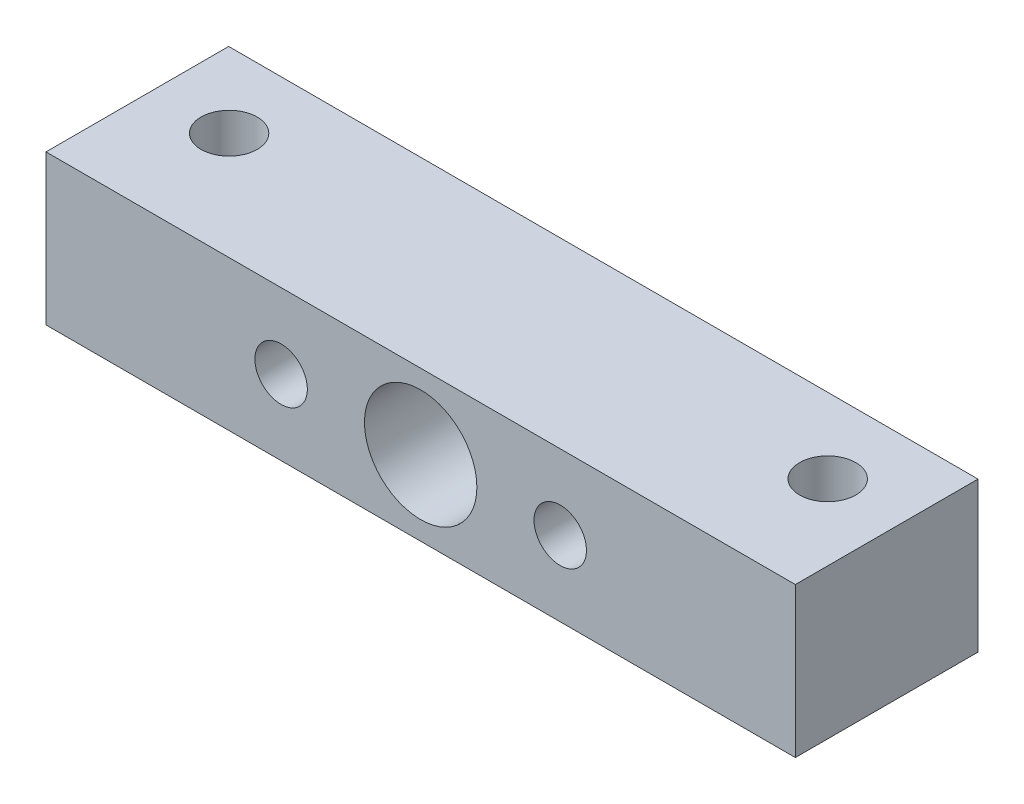
ISO-10303-21;
HEADER;
FILE_DESCRIPTION(('STEP AP214'),'2;1');
FILE_NAME('part.step','',(''),(''),'','','');
FILE_SCHEMA(('AUTOMOTIVE_DESIGN { 1 0 10303 214 1 1 1 1 }'));
ENDSEC;
DATA;
#1=APPLICATION_CONTEXT('core data for automotive mechanical design processes');
#2=APPLICATION_PROTOCOL_DEFINITION('international standard','automotive_design',2000,#1);
#3=PRODUCT_CONTEXT('',#1,'mechanical');
#4=PRODUCT('Part','Part','',(#3));
#5=PRODUCT_RELATED_PRODUCT_CATEGORY('part','',(#4));
#6=PRODUCT_DEFINITION_FORMATION('','',#4);
#7=PRODUCT_DEFINITION_CONTEXT('part definition',#1,'design');
#8=PRODUCT_DEFINITION('design','',#6,#7);
#9=PRODUCT_DEFINITION_SHAPE('','',#8);
#10=(LENGTH_UNIT() NAMED_UNIT(*) SI_UNIT(.MILLI.,.METRE.));
#11=(NAMED_UNIT(*) PLANE_ANGLE_UNIT() SI_UNIT($,.RADIAN.));
#12=(NAMED_UNIT(*) SI_UNIT($,.STERADIAN.) SOLID_ANGLE_UNIT());
#13=UNCERTAINTY_MEASURE_WITH_UNIT(LENGTH_MEASURE(1.E-05),#10,'distance_accuracy_value','');
#14=(GEOMETRIC_REPRESENTATION_CONTEXT(3) GLOBAL_UNCERTAINTY_ASSIGNED_CONTEXT((#13)) GLOBAL_UNIT_ASSIGNED_CONTEXT((#10,
#11,#12)) REPRESENTATION_CONTEXT('',''));
#15=CARTESIAN_POINT('',(0.,0.,0.));
#16=DIRECTION('',(0.,0.,1.));
#17=DIRECTION('',(1.,0.,0.));
#18=AXIS2_PLACEMENT_3D('',#15,#16,#17);
#19=CARTESIAN_POINT('',(0.,8.,0.));
#20=DIRECTION('',(0.,1.,0.));
#21=DIRECTION('',(0.,0.,1.));
#22=AXIS2_PLACEMENT_3D('',#19,#20,#21);
#23=PLANE('',#22);
#24=CARTESIAN_POINT('',(-15.9760563031056,8.,-0.874999999999995));
#25=DIRECTION('',(0.,1.,0.));
#26=DIRECTION('',(0.,0.,1.));
#27=AXIS2_PLACEMENT_3D('',#24,#25,#26);
#28=CIRCLE('',#27,1.5);
#29=CARTESIAN_POINT('',(-15.9760563031056,8.,0.625000000000005));
#30=VERTEX_POINT('',#29);
#31=EDGE_CURVE('E101',#30,#30,#28,.T.);
#32=ORIENTED_EDGE('',*,*,#31,.F.);
#33=EDGE_LOOP('',(#32));
#34=FACE_BOUND('',#33,.T.);
#35=DIRECTION('',(0.,0.,1.));
#36=VECTOR('',#35,1.);
#37=CARTESIAN_POINT('',(-20.,8.,4.875));
#38=LINE('',#37,#36);
#39=CARTESIAN_POINT('',(-20.,8.,-4.875));
#40=VERTEX_POINT('',#39);
#41=CARTESIAN_POINT('',(-20.,8.,4.875));
#42=VERTEX_POINT('',#41);
#43=EDGE_CURVE('E86',#40,#42,#38,.T.);
#44=ORIENTED_EDGE('',*,*,#43,.T.);
#45=DIRECTION('',(1.,0.,0.));
#46=VECTOR('',#45,1.);
#47=CARTESIAN_POINT('',(20.,8.,4.875));
#48=LINE('',#47,#46);
#49=CARTESIAN_POINT('',(20.,8.,4.875));
#50=VERTEX_POINT('',#49);
#51=EDGE_CURVE('E81',#42,#50,#48,.T.);
#52=ORIENTED_EDGE('',*,*,#51,.T.);
#53=DIRECTION('',(0.,0.,-1.));
#54=VECTOR('',#53,1.);
#55=CARTESIAN_POINT('',(20.,8.,4.875));
#56=LINE('',#55,#54);
#57=CARTESIAN_POINT('',(20.,8.,-4.875));
#58=VERTEX_POINT('',#57);
#59=EDGE_CURVE('E84',#50,#58,#56,.T.);
#60=ORIENTED_EDGE('',*,*,#59,.T.);
#61=DIRECTION('',(-1.,0.,0.));
#62=VECTOR('',#61,1.);
#63=CARTESIAN_POINT('',(20.,8.,-4.875));
#64=LINE('',#63,#62);
#65=EDGE_CURVE('E51',#58,#40,#64,.T.);
#66=ORIENTED_EDGE('',*,*,#65,.T.);
#67=EDGE_LOOP('',(#44,#52,#60,#66));
#68=FACE_BOUND('',#67,.T.);
#69=CARTESIAN_POINT('',(15.9760563031056,8.,-0.874999999999999));
#70=DIRECTION('',(0.,1.,0.));
#71=DIRECTION('',(0.,0.,-1.));
#72=AXIS2_PLACEMENT_3D('',#69,#70,#71);
#73=CIRCLE('',#72,1.5);
#74=CARTESIAN_POINT('',(15.9760563031056,8.,-2.375));
#75=VERTEX_POINT('',#74);
#76=EDGE_CURVE('E116',#75,#75,#73,.T.);
#77=ORIENTED_EDGE('',*,*,#76,.F.);
#78=EDGE_LOOP('',(#77));
#79=FACE_BOUND('',#78,.T.);
#80=ADVANCED_FACE('F34',(#34,#68,#79),#23,.T.);
#81=CARTESIAN_POINT('',(0.,0.,0.));
#82=DIRECTION('',(0.,1.,0.));
#83=DIRECTION('',(0.,0.,1.));
#84=AXIS2_PLACEMENT_3D('',#81,#82,#83);
#85=PLANE('',#84);
#86=DIRECTION('',(0.,0.,1.));
#87=VECTOR('',#86,1.);
#88=CARTESIAN_POINT('',(-20.,0.,4.875));
#89=LINE('',#88,#87);
#90=CARTESIAN_POINT('',(-20.,0.,-4.875));
#91=VERTEX_POINT('',#90);
#92=CARTESIAN_POINT('',(-20.,0.,4.875));
#93=VERTEX_POINT('',#92);
#94=EDGE_CURVE('E98',#91,#93,#89,.T.);
#95=ORIENTED_EDGE('',*,*,#94,.F.);
#96=DIRECTION('',(-1.,0.,0.));
#97=VECTOR('',#96,1.);
#98=CARTESIAN_POINT('',(20.,0.,-4.875));
#99=LINE('',#98,#97);
#100=CARTESIAN_POINT('',(20.,0.,-4.875));
#101=VERTEX_POINT('',#100);
#102=EDGE_CURVE('E74',#101,#91,#99,.T.);
#103=ORIENTED_EDGE('',*,*,#102,.F.);
#104=DIRECTION('',(0.,0.,-1.));
#105=VECTOR('',#104,1.);
#106=CARTESIAN_POINT('',(20.,0.,4.875));
#107=LINE('',#106,#105);
#108=CARTESIAN_POINT('',(20.,0.,4.875));
#109=VERTEX_POINT('',#108);
#110=EDGE_CURVE('E68',#109,#101,#107,.T.);
#111=ORIENTED_EDGE('',*,*,#110,.F.);
#112=DIRECTION('',(1.,0.,0.));
#113=VECTOR('',#112,1.);
#114=CARTESIAN_POINT('',(20.,0.,4.875));
#115=LINE('',#114,#113);
#116=EDGE_CURVE('E90',#93,#109,#115,.T.);
#117=ORIENTED_EDGE('',*,*,#116,.F.);
#118=EDGE_LOOP('',(#95,#103,#111,#117));
#119=FACE_BOUND('',#118,.T.);
#120=CARTESIAN_POINT('',(-15.9760563031056,0.,-0.874999999999995));
#121=DIRECTION('',(0.,1.,0.));
#122=DIRECTION('',(0.,0.,1.));
#123=AXIS2_PLACEMENT_3D('',#120,#121,#122);
#124=CIRCLE('',#123,1.5);
#125=CARTESIAN_POINT('',(-15.9760563031056,0.,0.625000000000005));
#126=VERTEX_POINT('',#125);
#127=EDGE_CURVE('E113',#126,#126,#124,.T.);
#128=ORIENTED_EDGE('',*,*,#127,.T.);
#129=EDGE_LOOP('',(#128));
#130=FACE_BOUND('',#129,.T.);
#131=CARTESIAN_POINT('',(15.9760563031056,0.,-0.874999999999999));
#132=DIRECTION('',(0.,1.,0.));
#133=DIRECTION('',(0.,0.,-1.));
#134=AXIS2_PLACEMENT_3D('',#131,#132,#133);
#135=CIRCLE('',#134,1.5);
#136=CARTESIAN_POINT('',(15.9760563031056,0.,-2.375));
#137=VERTEX_POINT('',#136);
#138=EDGE_CURVE('E119',#137,#137,#135,.T.);
#139=ORIENTED_EDGE('',*,*,#138,.T.);
#140=EDGE_LOOP('',(#139));
#141=FACE_BOUND('',#140,.T.);
#142=ADVANCED_FACE('F109',(#119,#130,#141),#85,.F.);
#143=CARTESIAN_POINT('',(-20.,8.,4.875));
#144=DIRECTION('',(1.,0.,0.));
#145=DIRECTION('',(0.,0.,-1.));
#146=AXIS2_PLACEMENT_3D('',#143,#144,#145);
#147=PLANE('',#146);
#148=ORIENTED_EDGE('',*,*,#94,.T.);
#149=DIRECTION('',(0.,-1.,0.));
#150=VECTOR('',#149,1.);
#151=CARTESIAN_POINT('',(-20.,8.,4.875));
#152=LINE('',#151,#150);
#153=EDGE_CURVE('E11',#42,#93,#152,.T.);
#154=ORIENTED_EDGE('',*,*,#153,.F.);
#155=ORIENTED_EDGE('',*,*,#43,.F.);
#156=DIRECTION('',(0.,-1.,0.));
#157=VECTOR('',#156,1.);
#158=CARTESIAN_POINT('',(-20.,8.,-4.875));
#159=LINE('',#158,#157);
#160=EDGE_CURVE('E94',#40,#91,#159,.T.);
#161=ORIENTED_EDGE('',*,*,#160,.T.);
#162=EDGE_LOOP('',(#148,#154,#155,#161));
#163=FACE_BOUND('',#162,.T.);
#164=ADVANCED_FACE('F36',(#163),#147,.F.);
#165=CARTESIAN_POINT('',(20.,8.,4.875));
#166=DIRECTION('',(0.,0.,-1.));
#167=DIRECTION('',(-1.,0.,0.));
#168=AXIS2_PLACEMENT_3D('',#165,#166,#167);
#169=PLANE('',#168);
#170=CARTESIAN_POINT('',(7.45,4.,4.875));
#171=DIRECTION('',(0.,0.,-1.));
#172=DIRECTION('',(-1.,0.,0.));
#173=AXIS2_PLACEMENT_3D('',#170,#171,#172);
#174=CIRCLE('',#173,1.4);
#175=CARTESIAN_POINT('',(6.05,4.,4.875));
#176=VERTEX_POINT('',#175);
#177=EDGE_CURVE('E139',#176,#176,#174,.F.);
#178=ORIENTED_EDGE('',*,*,#177,.F.);
#179=EDGE_LOOP('',(#178));
#180=FACE_BOUND('',#179,.T.);
#181=CARTESIAN_POINT('',(-7.45,4.,4.875));
#182=DIRECTION('',(0.,0.,-1.));
#183=DIRECTION('',(-1.,0.,0.));
#184=AXIS2_PLACEMENT_3D('',#181,#182,#183);
#185=CIRCLE('',#184,1.4);
#186=CARTESIAN_POINT('',(-8.85,4.,4.875));
#187=VERTEX_POINT('',#186);
#188=EDGE_CURVE('E130',#187,#187,#185,.F.);
#189=ORIENTED_EDGE('',*,*,#188,.F.);
#190=EDGE_LOOP('',(#189));
#191=FACE_BOUND('',#190,.T.);
#192=CARTESIAN_POINT('',(0.,3.99999999999999,4.875));
#193=DIRECTION('',(0.,0.,1.));
#194=DIRECTION('',(1.,0.,0.));
#195=AXIS2_PLACEMENT_3D('',#192,#193,#194);
#196=CIRCLE('',#195,3.);
#197=CARTESIAN_POINT('',(3.,3.99999999999999,4.875));
#198=VERTEX_POINT('',#197);
#199=EDGE_CURVE('E127',#198,#198,#196,.T.);
#200=ORIENTED_EDGE('',*,*,#199,.F.);
#201=EDGE_LOOP('',(#200));
#202=FACE_BOUND('',#201,.T.);
#203=ORIENTED_EDGE('',*,*,#116,.T.);
#204=DIRECTION('',(0.,-1.,0.));
#205=VECTOR('',#204,1.);
#206=CARTESIAN_POINT('',(20.,8.,4.875));
#207=LINE('',#206,#205);
#208=EDGE_CURVE('E43',#50,#109,#207,.T.);
#209=ORIENTED_EDGE('',*,*,#208,.F.);
#210=ORIENTED_EDGE('',*,*,#51,.F.);
#211=ORIENTED_EDGE('',*,*,#153,.T.);
#212=EDGE_LOOP('',(#203,#209,#210,#211));
#213=FACE_BOUND('',#212,.T.);
#214=ADVANCED_FACE('F89',(#180,#191,#202,#213),#169,.F.);
#215=CARTESIAN_POINT('',(20.,8.,4.875));
#216=DIRECTION('',(-1.,0.,0.));
#217=DIRECTION('',(0.,0.,1.));
#218=AXIS2_PLACEMENT_3D('',#215,#216,#217);
#219=PLANE('',#218);
#220=ORIENTED_EDGE('',*,*,#110,.T.);
#221=DIRECTION('',(0.,-1.,0.));
#222=VECTOR('',#221,1.);
#223=CARTESIAN_POINT('',(20.,8.,-4.875));
#224=LINE('',#223,#222);
#225=EDGE_CURVE('E91',#58,#101,#224,.T.);
#226=ORIENTED_EDGE('',*,*,#225,.F.);
#227=ORIENTED_EDGE('',*,*,#59,.F.);
#228=ORIENTED_EDGE('',*,*,#208,.T.);
#229=EDGE_LOOP('',(#220,#226,#227,#228));
#230=FACE_BOUND('',#229,.T.);
#231=ADVANCED_FACE('F92',(#230),#219,.F.);
#232=CARTESIAN_POINT('',(20.,8.,-4.875));
#233=DIRECTION('',(0.,0.,1.));
#234=DIRECTION('',(1.,0.,0.));
#235=AXIS2_PLACEMENT_3D('',#232,#233,#234);
#236=PLANE('',#235);
#237=CARTESIAN_POINT('',(7.45,4.,-4.875));
#238=DIRECTION('',(0.,0.,-1.));
#239=DIRECTION('',(-1.,0.,0.));
#240=AXIS2_PLACEMENT_3D('',#237,#238,#239);
#241=CIRCLE('',#240,1.4);
#242=CARTESIAN_POINT('',(6.05,4.,-4.875));
#243=VERTEX_POINT('',#242);
#244=EDGE_CURVE('E136',#243,#243,#241,.T.);
#245=ORIENTED_EDGE('',*,*,#244,.F.);
#246=EDGE_LOOP('',(#245));
#247=FACE_BOUND('',#246,.T.);
#248=CARTESIAN_POINT('',(-7.45,4.,-4.875));
#249=DIRECTION('',(0.,0.,-1.));
#250=DIRECTION('',(-1.,0.,0.));
#251=AXIS2_PLACEMENT_3D('',#248,#249,#250);
#252=CIRCLE('',#251,1.4);
#253=CARTESIAN_POINT('',(-8.85,4.,-4.875));
#254=VERTEX_POINT('',#253);
#255=EDGE_CURVE('E133',#254,#254,#252,.T.);
#256=ORIENTED_EDGE('',*,*,#255,.F.);
#257=EDGE_LOOP('',(#256));
#258=FACE_BOUND('',#257,.T.);
#259=CARTESIAN_POINT('',(0.,3.99999999999999,-4.875));
#260=DIRECTION('',(0.,0.,1.));
#261=DIRECTION('',(1.,0.,0.));
#262=AXIS2_PLACEMENT_3D('',#259,#260,#261);
#263=CIRCLE('',#262,3.);
#264=CARTESIAN_POINT('',(3.,3.99999999999999,-4.875));
#265=VERTEX_POINT('',#264);
#266=EDGE_CURVE('E122',#265,#265,#263,.F.);
#267=ORIENTED_EDGE('',*,*,#266,.F.);
#268=EDGE_LOOP('',(#267));
#269=FACE_BOUND('',#268,.T.);
#270=ORIENTED_EDGE('',*,*,#102,.T.);
#271=ORIENTED_EDGE('',*,*,#160,.F.);
#272=ORIENTED_EDGE('',*,*,#65,.F.);
#273=ORIENTED_EDGE('',*,*,#225,.T.);
#274=EDGE_LOOP('',(#270,#271,#272,#273));
#275=FACE_BOUND('',#274,.T.);
#276=ADVANCED_FACE('F106',(#247,#258,#269,#275),#236,.F.);
#277=CARTESIAN_POINT('',(-15.9760563031056,8.,-0.874999999999995));
#278=DIRECTION('',(0.,-1.,0.));
#279=DIRECTION('',(0.,0.,-1.));
#280=AXIS2_PLACEMENT_3D('',#277,#278,#279);
#281=CYLINDRICAL_SURFACE('',#280,1.5);
#282=ORIENTED_EDGE('',*,*,#31,.T.);
#283=EDGE_LOOP('',(#282));
#284=FACE_BOUND('',#283,.T.);
#285=ORIENTED_EDGE('',*,*,#127,.F.);
#286=EDGE_LOOP('',(#285));
#287=FACE_BOUND('',#286,.T.);
#288=ADVANCED_FACE('F160',(#284,#287),#281,.F.);
#289=CARTESIAN_POINT('',(15.9760563031056,8.,-0.874999999999999));
#290=DIRECTION('',(0.,-1.,0.));
#291=DIRECTION('',(0.,0.,-1.));
#292=AXIS2_PLACEMENT_3D('',#289,#290,#291);
#293=CYLINDRICAL_SURFACE('',#292,1.5);
#294=ORIENTED_EDGE('',*,*,#76,.T.);
#295=EDGE_LOOP('',(#294));
#296=FACE_BOUND('',#295,.T.);
#297=ORIENTED_EDGE('',*,*,#138,.F.);
#298=EDGE_LOOP('',(#297));
#299=FACE_BOUND('',#298,.T.);
#300=ADVANCED_FACE('F155',(#296,#299),#293,.F.);
#301=CARTESIAN_POINT('',(0.,3.99999999999999,-4.876));
#302=DIRECTION('',(0.,0.,1.));
#303=DIRECTION('',(1.,0.,0.));
#304=AXIS2_PLACEMENT_3D('',#301,#302,#303);
#305=CYLINDRICAL_SURFACE('',#304,3.);
#306=ORIENTED_EDGE('',*,*,#199,.T.);
#307=EDGE_LOOP('',(#306));
#308=FACE_BOUND('',#307,.T.);
#309=ORIENTED_EDGE('',*,*,#266,.T.);
#310=EDGE_LOOP('',(#309));
#311=FACE_BOUND('',#310,.T.);
#312=ADVANCED_FACE('F151',(#308,#311),#305,.F.);
#313=CARTESIAN_POINT('',(-7.45,4.,4.87600000000001));
#314=DIRECTION('',(0.,0.,-1.));
#315=DIRECTION('',(-1.,0.,0.));
#316=AXIS2_PLACEMENT_3D('',#313,#314,#315);
#317=CYLINDRICAL_SURFACE('',#316,1.4);
#318=ORIENTED_EDGE('',*,*,#255,.T.);
#319=EDGE_LOOP('',(#318));
#320=FACE_BOUND('',#319,.T.);
#321=ORIENTED_EDGE('',*,*,#188,.T.);
#322=EDGE_LOOP('',(#321));
#323=FACE_BOUND('',#322,.T.);
#324=ADVANCED_FACE('F154',(#320,#323),#317,.F.);
#325=CARTESIAN_POINT('',(7.45,4.,4.87600000000001));
#326=DIRECTION('',(0.,0.,-1.));
#327=DIRECTION('',(-1.,0.,0.));
#328=AXIS2_PLACEMENT_3D('',#325,#326,#327);
#329=CYLINDRICAL_SURFACE('',#328,1.4);
#330=ORIENTED_EDGE('',*,*,#244,.T.);
#331=EDGE_LOOP('',(#330));
#332=FACE_BOUND('',#331,.T.);
#333=ORIENTED_EDGE('',*,*,#177,.T.);
#334=EDGE_LOOP('',(#333));
#335=FACE_BOUND('',#334,.T.);
#336=ADVANCED_FACE('F143',(#332,#335),#329,.F.);
#337=CLOSED_SHELL('',(#80,#142,#164,#214,#231,#276,#288,#300,#312,#324,#336));
#338=MANIFOLD_SOLID_BREP('B2',#337);
#339=ADVANCED_BREP_SHAPE_REPRESENTATION('',(#18,#338),#14);
#340=SHAPE_DEFINITION_REPRESENTATION(#9,#339);
ENDSEC;
END-ISO-10303-21;
